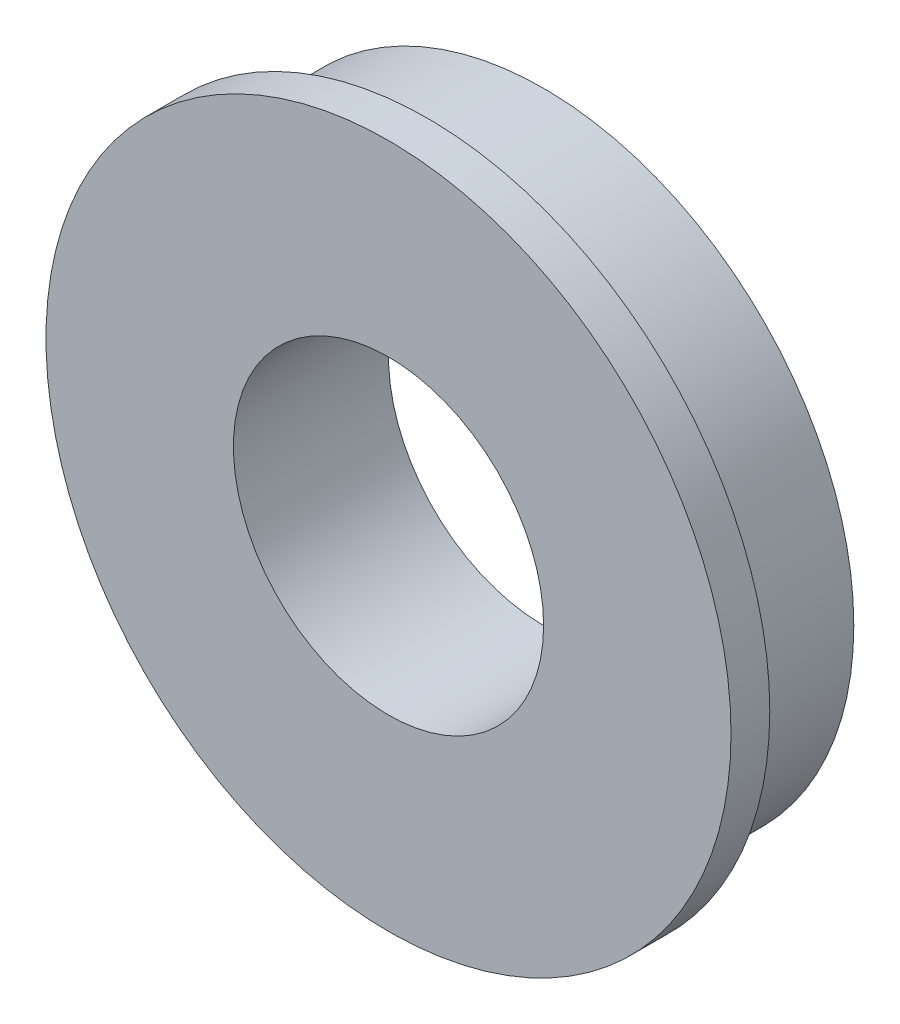
ISO-10303-21;
HEADER;
FILE_DESCRIPTION(('STEP AP214'),'2;1');
FILE_NAME('part.step','',(''),(''),'','','');
FILE_SCHEMA(('AUTOMOTIVE_DESIGN { 1 0 10303 214 1 1 1 1 }'));
ENDSEC;
DATA;
#1=APPLICATION_CONTEXT('core data for automotive mechanical design processes');
#2=APPLICATION_PROTOCOL_DEFINITION('international standard','automotive_design',2000,#1);
#3=PRODUCT_CONTEXT('',#1,'mechanical');
#4=PRODUCT('Part','Part','',(#3));
#5=PRODUCT_RELATED_PRODUCT_CATEGORY('part','',(#4));
#6=PRODUCT_DEFINITION_FORMATION('','',#4);
#7=PRODUCT_DEFINITION_CONTEXT('part definition',#1,'design');
#8=PRODUCT_DEFINITION('design','',#6,#7);
#9=PRODUCT_DEFINITION_SHAPE('','',#8);
#10=(LENGTH_UNIT() NAMED_UNIT(*) SI_UNIT(.MILLI.,.METRE.));
#11=(NAMED_UNIT(*) PLANE_ANGLE_UNIT() SI_UNIT($,.RADIAN.));
#12=(NAMED_UNIT(*) SI_UNIT($,.STERADIAN.) SOLID_ANGLE_UNIT());
#13=UNCERTAINTY_MEASURE_WITH_UNIT(LENGTH_MEASURE(1.E-05),#10,'distance_accuracy_value','');
#14=(GEOMETRIC_REPRESENTATION_CONTEXT(3) GLOBAL_UNCERTAINTY_ASSIGNED_CONTEXT((#13)) GLOBAL_UNIT_ASSIGNED_CONTEXT((#10,
#11,#12)) REPRESENTATION_CONTEXT('',''));
#15=CARTESIAN_POINT('',(0.,0.,0.));
#16=DIRECTION('',(0.,0.,1.));
#17=DIRECTION('',(1.,0.,0.));
#18=AXIS2_PLACEMENT_3D('',#15,#16,#17);
#19=CARTESIAN_POINT('',(0.,0.,-4.5));
#20=DIRECTION('',(0.,0.,1.));
#21=DIRECTION('',(1.,0.,0.));
#22=AXIS2_PLACEMENT_3D('',#19,#20,#21);
#23=CYLINDRICAL_SURFACE('',#22,12.);
#24=CARTESIAN_POINT('',(0.,0.,-4.5));
#25=DIRECTION('',(0.,0.,1.));
#26=DIRECTION('',(1.,0.,0.));
#27=AXIS2_PLACEMENT_3D('',#24,#25,#26);
#28=CIRCLE('',#27,12.);
#29=CARTESIAN_POINT('',(12.,0.,-4.5));
#30=VERTEX_POINT('',#29);
#31=EDGE_CURVE('E10',#30,#30,#28,.T.);
#32=ORIENTED_EDGE('',*,*,#31,.T.);
#33=EDGE_LOOP('',(#32));
#34=FACE_BOUND('',#33,.T.);
#35=CARTESIAN_POINT('',(0.,0.,0.));
#36=DIRECTION('',(0.,0.,1.));
#37=DIRECTION('',(1.,0.,0.));
#38=AXIS2_PLACEMENT_3D('',#35,#36,#37);
#39=CIRCLE('',#38,12.);
#40=CARTESIAN_POINT('',(12.,0.,0.));
#41=VERTEX_POINT('',#40);
#42=EDGE_CURVE('E39',#41,#41,#39,.T.);
#43=ORIENTED_EDGE('',*,*,#42,.F.);
#44=EDGE_LOOP('',(#43));
#45=FACE_BOUND('',#44,.T.);
#46=ADVANCED_FACE('F36',(#34,#45),#23,.T.);
#47=CARTESIAN_POINT('',(0.,0.,-4.5));
#48=DIRECTION('',(0.,0.,1.));
#49=DIRECTION('',(1.,0.,0.));
#50=AXIS2_PLACEMENT_3D('',#47,#48,#49);
#51=PLANE('',#50);
#52=CARTESIAN_POINT('',(0.,0.,-4.5));
#53=DIRECTION('',(0.,0.,1.));
#54=DIRECTION('',(1.,0.,0.));
#55=AXIS2_PLACEMENT_3D('',#52,#53,#54);
#56=CIRCLE('',#55,6.);
#57=CARTESIAN_POINT('',(6.,0.,-4.5));
#58=VERTEX_POINT('',#57);
#59=EDGE_CURVE('E51',#58,#58,#56,.T.);
#60=ORIENTED_EDGE('',*,*,#59,.T.);
#61=EDGE_LOOP('',(#60));
#62=FACE_BOUND('',#61,.T.);
#63=ORIENTED_EDGE('',*,*,#31,.F.);
#64=EDGE_LOOP('',(#63));
#65=FACE_BOUND('',#64,.T.);
#66=ADVANCED_FACE('F60',(#62,#65),#51,.F.);
#67=CARTESIAN_POINT('',(0.,0.,1.5));
#68=DIRECTION('',(0.,0.,-1.));
#69=DIRECTION('',(-1.,0.,0.));
#70=AXIS2_PLACEMENT_3D('',#67,#68,#69);
#71=CYLINDRICAL_SURFACE('',#70,13.25);
#72=CARTESIAN_POINT('',(0.,0.,1.5));
#73=DIRECTION('',(0.,0.,1.));
#74=DIRECTION('',(1.,0.,0.));
#75=AXIS2_PLACEMENT_3D('',#72,#73,#74);
#76=CIRCLE('',#75,13.25);
#77=CARTESIAN_POINT('',(13.25,0.,1.5));
#78=VERTEX_POINT('',#77);
#79=EDGE_CURVE('E46',#78,#78,#76,.T.);
#80=ORIENTED_EDGE('',*,*,#79,.F.);
#81=EDGE_LOOP('',(#80));
#82=FACE_BOUND('',#81,.T.);
#83=CARTESIAN_POINT('',(0.,0.,0.));
#84=DIRECTION('',(0.,0.,1.));
#85=DIRECTION('',(1.,0.,0.));
#86=AXIS2_PLACEMENT_3D('',#83,#84,#85);
#87=CIRCLE('',#86,13.25);
#88=CARTESIAN_POINT('',(13.25,0.,0.));
#89=VERTEX_POINT('',#88);
#90=EDGE_CURVE('E48',#89,#89,#87,.T.);
#91=ORIENTED_EDGE('',*,*,#90,.T.);
#92=EDGE_LOOP('',(#91));
#93=FACE_BOUND('',#92,.T.);
#94=ADVANCED_FACE('F73',(#82,#93),#71,.T.);
#95=CARTESIAN_POINT('',(0.,0.,1.5));
#96=DIRECTION('',(0.,0.,1.));
#97=DIRECTION('',(1.,0.,0.));
#98=AXIS2_PLACEMENT_3D('',#95,#96,#97);
#99=PLANE('',#98);
#100=CARTESIAN_POINT('',(0.,0.,1.5));
#101=DIRECTION('',(0.,0.,1.));
#102=DIRECTION('',(1.,0.,0.));
#103=AXIS2_PLACEMENT_3D('',#100,#101,#102);
#104=CIRCLE('',#103,6.);
#105=CARTESIAN_POINT('',(6.,0.,1.5));
#106=VERTEX_POINT('',#105);
#107=EDGE_CURVE('E54',#106,#106,#104,.T.);
#108=ORIENTED_EDGE('',*,*,#107,.F.);
#109=EDGE_LOOP('',(#108));
#110=FACE_BOUND('',#109,.T.);
#111=ORIENTED_EDGE('',*,*,#79,.T.);
#112=EDGE_LOOP('',(#111));
#113=FACE_BOUND('',#112,.T.);
#114=ADVANCED_FACE('F70',(#110,#113),#99,.T.);
#115=CARTESIAN_POINT('',(0.,0.,0.));
#116=DIRECTION('',(0.,0.,1.));
#117=DIRECTION('',(1.,0.,0.));
#118=AXIS2_PLACEMENT_3D('',#115,#116,#117);
#119=PLANE('',#118);
#120=ORIENTED_EDGE('',*,*,#42,.T.);
#121=EDGE_LOOP('',(#120));
#122=FACE_BOUND('',#121,.T.);
#123=ORIENTED_EDGE('',*,*,#90,.F.);
#124=EDGE_LOOP('',(#123));
#125=FACE_BOUND('',#124,.T.);
#126=ADVANCED_FACE('F66',(#122,#125),#119,.F.);
#127=CARTESIAN_POINT('',(0.,0.,-4.5));
#128=DIRECTION('',(0.,0.,1.));
#129=DIRECTION('',(1.,0.,0.));
#130=AXIS2_PLACEMENT_3D('',#127,#128,#129);
#131=CYLINDRICAL_SURFACE('',#130,6.);
#132=ORIENTED_EDGE('',*,*,#59,.F.);
#133=EDGE_LOOP('',(#132));
#134=FACE_BOUND('',#133,.T.);
#135=ORIENTED_EDGE('',*,*,#107,.T.);
#136=EDGE_LOOP('',(#135));
#137=FACE_BOUND('',#136,.T.);
#138=ADVANCED_FACE('F63',(#134,#137),#131,.F.);
#139=CLOSED_SHELL('',(#46,#66,#94,#114,#126,#138));
#140=MANIFOLD_SOLID_BREP('B2',#139);
#141=ADVANCED_BREP_SHAPE_REPRESENTATION('',(#18,#140),#14);
#142=SHAPE_DEFINITION_REPRESENTATION(#9,#141);
ENDSEC;
END-ISO-10303-21;
